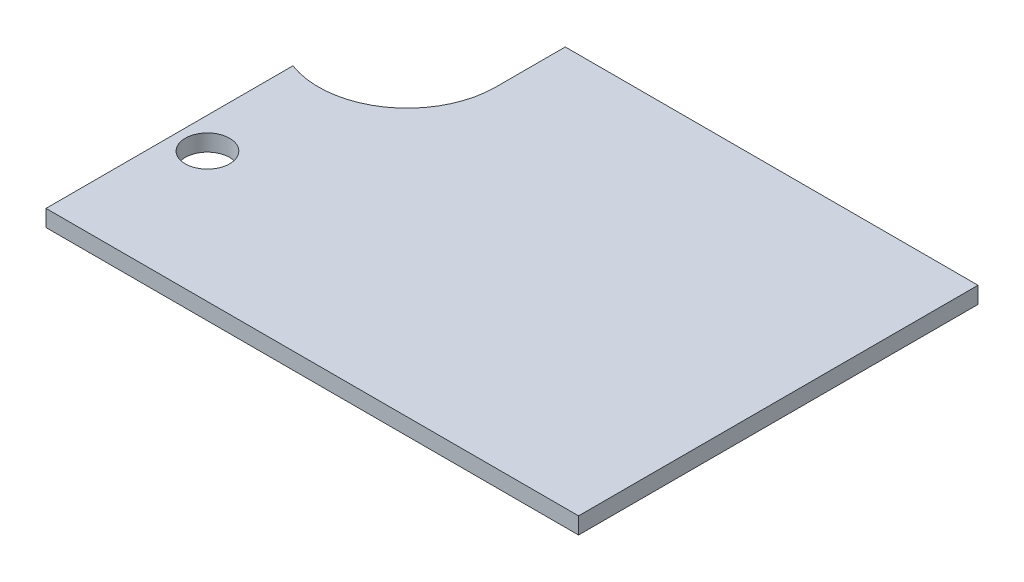
ISO-10303-21;
HEADER;
FILE_DESCRIPTION(('STEP AP214'),'2;1');
FILE_NAME('part.step','',(''),(''),'','','');
FILE_SCHEMA(('AUTOMOTIVE_DESIGN { 1 0 10303 214 1 1 1 1 }'));
ENDSEC;
DATA;
#1=APPLICATION_CONTEXT('core data for automotive mechanical design processes');
#2=APPLICATION_PROTOCOL_DEFINITION('international standard','automotive_design',2000,#1);
#3=PRODUCT_CONTEXT('',#1,'mechanical');
#4=PRODUCT('Part','Part','',(#3));
#5=PRODUCT_RELATED_PRODUCT_CATEGORY('part','',(#4));
#6=PRODUCT_DEFINITION_FORMATION('','',#4);
#7=PRODUCT_DEFINITION_CONTEXT('part definition',#1,'design');
#8=PRODUCT_DEFINITION('design','',#6,#7);
#9=PRODUCT_DEFINITION_SHAPE('','',#8);
#10=(LENGTH_UNIT() NAMED_UNIT(*) SI_UNIT(.MILLI.,.METRE.));
#11=(NAMED_UNIT(*) PLANE_ANGLE_UNIT() SI_UNIT($,.RADIAN.));
#12=(NAMED_UNIT(*) SI_UNIT($,.STERADIAN.) SOLID_ANGLE_UNIT());
#13=UNCERTAINTY_MEASURE_WITH_UNIT(LENGTH_MEASURE(1.E-05),#10,'distance_accuracy_value','');
#14=(GEOMETRIC_REPRESENTATION_CONTEXT(3) GLOBAL_UNCERTAINTY_ASSIGNED_CONTEXT((#13)) GLOBAL_UNIT_ASSIGNED_CONTEXT((#10,
#11,#12)) REPRESENTATION_CONTEXT('',''));
#15=CARTESIAN_POINT('',(0.,0.,0.));
#16=DIRECTION('',(0.,0.,1.));
#17=DIRECTION('',(1.,0.,0.));
#18=AXIS2_PLACEMENT_3D('',#15,#16,#17);
#19=CARTESIAN_POINT('',(-304.8,19.05,-228.6));
#20=DIRECTION('',(1.,0.,0.));
#21=DIRECTION('',(0.,0.,-1.));
#22=AXIS2_PLACEMENT_3D('',#19,#20,#21);
#23=PLANE('',#22);
#24=DIRECTION('',(0.,0.,1.));
#25=VECTOR('',#24,1.);
#26=CARTESIAN_POINT('',(-304.8,19.05,-228.6));
#27=LINE('',#26,#25);
#28=CARTESIAN_POINT('',(-304.8,19.05,-54.0512305043983));
#29=VERTEX_POINT('',#28);
#30=CARTESIAN_POINT('',(-304.8,19.05,228.6));
#31=VERTEX_POINT('',#30);
#32=EDGE_CURVE('E78',#29,#31,#27,.T.);
#33=ORIENTED_EDGE('',*,*,#32,.F.);
#34=DIRECTION('',(0.,-1.,0.));
#35=VECTOR('',#34,1.);
#36=CARTESIAN_POINT('',(-304.8,19.05,-54.0512305043983));
#37=LINE('',#36,#35);
#38=CARTESIAN_POINT('',(-304.8,0.,-54.0512305043983));
#39=VERTEX_POINT('',#38);
#40=EDGE_CURVE('E129',#29,#39,#37,.T.);
#41=ORIENTED_EDGE('',*,*,#40,.T.);
#42=DIRECTION('',(0.,0.,1.));
#43=VECTOR('',#42,1.);
#44=CARTESIAN_POINT('',(-304.8,0.,-228.6));
#45=LINE('',#44,#43);
#46=CARTESIAN_POINT('',(-304.8,0.,228.6));
#47=VERTEX_POINT('',#46);
#48=EDGE_CURVE('E123',#39,#47,#45,.T.);
#49=ORIENTED_EDGE('',*,*,#48,.T.);
#50=DIRECTION('',(0.,-1.,0.));
#51=VECTOR('',#50,1.);
#52=CARTESIAN_POINT('',(-304.8,19.05,228.6));
#53=LINE('',#52,#51);
#54=EDGE_CURVE('E11',#31,#47,#53,.T.);
#55=ORIENTED_EDGE('',*,*,#54,.F.);
#56=EDGE_LOOP('',(#33,#41,#49,#55));
#57=FACE_BOUND('',#56,.T.);
#58=ADVANCED_FACE('F33',(#57),#23,.F.);
#59=CARTESIAN_POINT('',(-304.8,19.05,228.6));
#60=DIRECTION('',(0.,0.,-1.));
#61=DIRECTION('',(-1.,0.,0.));
#62=AXIS2_PLACEMENT_3D('',#59,#60,#61);
#63=PLANE('',#62);
#64=DIRECTION('',(1.,0.,0.));
#65=VECTOR('',#64,1.);
#66=CARTESIAN_POINT('',(-304.8,0.,228.6));
#67=LINE('',#66,#65);
#68=CARTESIAN_POINT('',(304.8,0.,228.6));
#69=VERTEX_POINT('',#68);
#70=EDGE_CURVE('E114',#47,#69,#67,.T.);
#71=ORIENTED_EDGE('',*,*,#70,.T.);
#72=DIRECTION('',(0.,-1.,0.));
#73=VECTOR('',#72,1.);
#74=CARTESIAN_POINT('',(304.8,19.05,228.6));
#75=LINE('',#74,#73);
#76=CARTESIAN_POINT('',(304.8,19.05,228.6));
#77=VERTEX_POINT('',#76);
#78=EDGE_CURVE('E40',#77,#69,#75,.T.);
#79=ORIENTED_EDGE('',*,*,#78,.F.);
#80=DIRECTION('',(1.,0.,0.));
#81=VECTOR('',#80,1.);
#82=CARTESIAN_POINT('',(-304.8,19.05,228.6));
#83=LINE('',#82,#81);
#84=EDGE_CURVE('E112',#31,#77,#83,.T.);
#85=ORIENTED_EDGE('',*,*,#84,.F.);
#86=ORIENTED_EDGE('',*,*,#54,.T.);
#87=EDGE_LOOP('',(#71,#79,#85,#86));
#88=FACE_BOUND('',#87,.T.);
#89=ADVANCED_FACE('F125',(#88),#63,.F.);
#90=CARTESIAN_POINT('',(304.8,19.05,-228.6));
#91=DIRECTION('',(-1.,0.,0.));
#92=DIRECTION('',(0.,0.,1.));
#93=AXIS2_PLACEMENT_3D('',#90,#91,#92);
#94=PLANE('',#93);
#95=DIRECTION('',(0.,0.,-1.));
#96=VECTOR('',#95,1.);
#97=CARTESIAN_POINT('',(304.8,0.,-228.6));
#98=LINE('',#97,#96);
#99=CARTESIAN_POINT('',(304.8,0.,-228.6));
#100=VERTEX_POINT('',#99);
#101=EDGE_CURVE('E73',#69,#100,#98,.T.);
#102=ORIENTED_EDGE('',*,*,#101,.T.);
#103=DIRECTION('',(0.,-1.,0.));
#104=VECTOR('',#103,1.);
#105=CARTESIAN_POINT('',(304.8,19.05,-228.6));
#106=LINE('',#105,#104);
#107=CARTESIAN_POINT('',(304.8,19.05,-228.6));
#108=VERTEX_POINT('',#107);
#109=EDGE_CURVE('E110',#108,#100,#106,.T.);
#110=ORIENTED_EDGE('',*,*,#109,.F.);
#111=DIRECTION('',(0.,0.,-1.));
#112=VECTOR('',#111,1.);
#113=CARTESIAN_POINT('',(304.8,19.05,-228.6));
#114=LINE('',#113,#112);
#115=EDGE_CURVE('E56',#77,#108,#114,.T.);
#116=ORIENTED_EDGE('',*,*,#115,.F.);
#117=ORIENTED_EDGE('',*,*,#78,.T.);
#118=EDGE_LOOP('',(#102,#110,#116,#117));
#119=FACE_BOUND('',#118,.T.);
#120=ADVANCED_FACE('F120',(#119),#94,.F.);
#121=CARTESIAN_POINT('',(-304.8,19.05,-228.6));
#122=DIRECTION('',(0.,0.,1.));
#123=DIRECTION('',(1.,0.,0.));
#124=AXIS2_PLACEMENT_3D('',#121,#122,#123);
#125=PLANE('',#124);
#126=DIRECTION('',(-1.,0.,0.));
#127=VECTOR('',#126,1.);
#128=CARTESIAN_POINT('',(-304.8,0.,-228.6));
#129=LINE('',#128,#127);
#130=CARTESIAN_POINT('',(-167.639999999999,0.,-228.6));
#131=VERTEX_POINT('',#130);
#132=EDGE_CURVE('E105',#100,#131,#129,.T.);
#133=ORIENTED_EDGE('',*,*,#132,.T.);
#134=DIRECTION('',(0.,1.,0.));
#135=VECTOR('',#134,1.);
#136=CARTESIAN_POINT('',(-167.639999999999,0.,-228.6));
#137=LINE('',#136,#135);
#138=CARTESIAN_POINT('',(-167.639999999999,19.05,-228.6));
#139=VERTEX_POINT('',#138);
#140=EDGE_CURVE('E92',#131,#139,#137,.T.);
#141=ORIENTED_EDGE('',*,*,#140,.T.);
#142=DIRECTION('',(-1.,0.,0.));
#143=VECTOR('',#142,1.);
#144=CARTESIAN_POINT('',(-304.8,19.05,-228.6));
#145=LINE('',#144,#143);
#146=EDGE_CURVE('E118',#108,#139,#145,.T.);
#147=ORIENTED_EDGE('',*,*,#146,.F.);
#148=ORIENTED_EDGE('',*,*,#109,.T.);
#149=EDGE_LOOP('',(#133,#141,#147,#148));
#150=FACE_BOUND('',#149,.T.);
#151=ADVANCED_FACE('F109',(#150),#125,.F.);
#152=CARTESIAN_POINT('',(-304.8,19.05,228.6));
#153=DIRECTION('',(0.,1.,0.));
#154=DIRECTION('',(0.,0.,1.));
#155=AXIS2_PLACEMENT_3D('',#152,#153,#154);
#156=PLANE('',#155);
#157=DIRECTION('',(0.,0.,-1.));
#158=VECTOR('',#157,1.);
#159=CARTESIAN_POINT('',(-167.639999999999,19.05,-149.22499999999));
#160=LINE('',#159,#158);
#161=CARTESIAN_POINT('',(-167.639999999999,19.05,-149.22499999999));
#162=VERTEX_POINT('',#161);
#163=EDGE_CURVE('E95',#162,#139,#160,.T.);
#164=ORIENTED_EDGE('',*,*,#163,.F.);
#165=CARTESIAN_POINT('',(-269.239999999999,19.05,-149.22499999999));
#166=DIRECTION('',(0.,-1.,0.));
#167=DIRECTION('',(0.,0.,-1.));
#168=AXIS2_PLACEMENT_3D('',#165,#166,#167);
#169=CIRCLE('',#168,101.6);
#170=EDGE_CURVE('E142',#162,#29,#169,.T.);
#171=ORIENTED_EDGE('',*,*,#170,.T.);
#172=ORIENTED_EDGE('',*,*,#32,.T.);
#173=ORIENTED_EDGE('',*,*,#84,.T.);
#174=ORIENTED_EDGE('',*,*,#115,.T.);
#175=ORIENTED_EDGE('',*,*,#146,.T.);
#176=EDGE_LOOP('',(#164,#171,#172,#173,#174,#175));
#177=FACE_BOUND('',#176,.T.);
#178=CARTESIAN_POINT('',(-269.239999999999,19.05,79.3750000000104));
#179=DIRECTION('',(0.,-1.,0.));
#180=DIRECTION('',(0.,0.,-1.));
#181=AXIS2_PLACEMENT_3D('',#178,#179,#180);
#182=CIRCLE('',#181,25.4);
#183=CARTESIAN_POINT('',(-269.239999999999,19.05,53.9750000000104));
#184=VERTEX_POINT('',#183);
#185=EDGE_CURVE('E130',#184,#184,#182,.T.);
#186=ORIENTED_EDGE('',*,*,#185,.T.);
#187=EDGE_LOOP('',(#186));
#188=FACE_BOUND('',#187,.T.);
#189=ADVANCED_FACE('F148',(#177,#188),#156,.T.);
#190=CARTESIAN_POINT('',(-304.8,0.,228.6));
#191=DIRECTION('',(0.,1.,0.));
#192=DIRECTION('',(0.,0.,1.));
#193=AXIS2_PLACEMENT_3D('',#190,#191,#192);
#194=PLANE('',#193);
#195=CARTESIAN_POINT('',(-269.239999999999,0.,79.3750000000104));
#196=DIRECTION('',(0.,-1.,0.));
#197=DIRECTION('',(0.,0.,-1.));
#198=AXIS2_PLACEMENT_3D('',#195,#196,#197);
#199=CIRCLE('',#198,25.4);
#200=CARTESIAN_POINT('',(-269.239999999999,0.,53.9750000000104));
#201=VERTEX_POINT('',#200);
#202=EDGE_CURVE('E133',#201,#201,#199,.T.);
#203=ORIENTED_EDGE('',*,*,#202,.F.);
#204=EDGE_LOOP('',(#203));
#205=FACE_BOUND('',#204,.T.);
#206=CARTESIAN_POINT('',(-269.239999999999,0.,-149.22499999999));
#207=DIRECTION('',(0.,-1.,0.));
#208=DIRECTION('',(0.,0.,-1.));
#209=AXIS2_PLACEMENT_3D('',#206,#207,#208);
#210=CIRCLE('',#209,101.6);
#211=CARTESIAN_POINT('',(-167.639999999999,0.,-149.22499999999));
#212=VERTEX_POINT('',#211);
#213=EDGE_CURVE('E107',#212,#39,#210,.T.);
#214=ORIENTED_EDGE('',*,*,#213,.F.);
#215=DIRECTION('',(0.,0.,-1.));
#216=VECTOR('',#215,1.);
#217=CARTESIAN_POINT('',(-167.639999999999,0.,-149.22499999999));
#218=LINE('',#217,#216);
#219=EDGE_CURVE('E47',#212,#131,#218,.T.);
#220=ORIENTED_EDGE('',*,*,#219,.T.);
#221=ORIENTED_EDGE('',*,*,#132,.F.);
#222=ORIENTED_EDGE('',*,*,#101,.F.);
#223=ORIENTED_EDGE('',*,*,#70,.F.);
#224=ORIENTED_EDGE('',*,*,#48,.F.);
#225=EDGE_LOOP('',(#214,#220,#221,#222,#223,#224));
#226=FACE_BOUND('',#225,.T.);
#227=ADVANCED_FACE('F104',(#205,#226),#194,.F.);
#228=CARTESIAN_POINT('',(-269.239999999999,19.05,79.3750000000104));
#229=DIRECTION('',(0.,-1.,0.));
#230=DIRECTION('',(0.,0.,-1.));
#231=AXIS2_PLACEMENT_3D('',#228,#229,#230);
#232=CYLINDRICAL_SURFACE('',#231,25.4);
#233=CARTESIAN_POINT('',(-269.239999999999,19.05,53.9750000000104));
#234=CARTESIAN_POINT('',(-269.239999999999,18.8515625,53.9750000000104));
#235=CARTESIAN_POINT('',(-269.239999999999,18.653125,53.9750000000104));
#236=CARTESIAN_POINT('',(-269.239999999999,18.25625,53.9750000000104));
#237=CARTESIAN_POINT('',(-269.239999999999,18.0578125,53.9750000000104));
#238=CARTESIAN_POINT('',(-269.239999999999,17.6609375,53.9750000000104));
#239=CARTESIAN_POINT('',(-269.239999999999,17.4625,53.9750000000104));
#240=CARTESIAN_POINT('',(-269.239999999999,17.065625,53.9750000000104));
#241=CARTESIAN_POINT('',(-269.239999999999,16.8671875,53.9750000000104));
#242=CARTESIAN_POINT('',(-269.239999999999,16.4703125,53.9750000000104));
#243=CARTESIAN_POINT('',(-269.239999999999,16.271875,53.9750000000104));
#244=CARTESIAN_POINT('',(-269.239999999999,15.875,53.9750000000104));
#245=CARTESIAN_POINT('',(-269.239999999999,15.6765625,53.9750000000104));
#246=CARTESIAN_POINT('',(-269.239999999999,15.2796875,53.9750000000104));
#247=CARTESIAN_POINT('',(-269.239999999999,15.08125,53.9750000000104));
#248=CARTESIAN_POINT('',(-269.239999999999,14.684375,53.9750000000104));
#249=CARTESIAN_POINT('',(-269.239999999999,14.4859375,53.9750000000104));
#250=CARTESIAN_POINT('',(-269.239999999999,14.0890625,53.9750000000104));
#251=CARTESIAN_POINT('',(-269.239999999999,13.890625,53.9750000000104));
#252=CARTESIAN_POINT('',(-269.239999999999,13.49375,53.9750000000104));
#253=CARTESIAN_POINT('',(-269.239999999999,13.2953125,53.9750000000104));
#254=CARTESIAN_POINT('',(-269.239999999999,12.8984375,53.9750000000104));
#255=CARTESIAN_POINT('',(-269.239999999999,12.7,53.9750000000104));
#256=CARTESIAN_POINT('',(-269.239999999999,12.303125,53.9750000000104));
#257=CARTESIAN_POINT('',(-269.239999999999,12.1046875,53.9750000000104));
#258=CARTESIAN_POINT('',(-269.239999999999,11.7078125,53.9750000000104));
#259=CARTESIAN_POINT('',(-269.239999999999,11.509375,53.9750000000104));
#260=CARTESIAN_POINT('',(-269.239999999999,11.1125,53.9750000000104));
#261=CARTESIAN_POINT('',(-269.239999999999,10.9140625,53.9750000000104));
#262=CARTESIAN_POINT('',(-269.239999999999,10.5171875,53.9750000000104));
#263=CARTESIAN_POINT('',(-269.239999999999,10.31875,53.9750000000104));
#264=CARTESIAN_POINT('',(-269.239999999999,9.921875,53.9750000000104));
#265=CARTESIAN_POINT('',(-269.239999999999,9.7234375,53.9750000000104));
#266=CARTESIAN_POINT('',(-269.239999999999,9.3265625,53.9750000000104));
#267=CARTESIAN_POINT('',(-269.239999999999,9.128125,53.9750000000104));
#268=CARTESIAN_POINT('',(-269.239999999999,8.73125,53.9750000000104));
#269=CARTESIAN_POINT('',(-269.239999999999,8.5328125,53.9750000000104));
#270=CARTESIAN_POINT('',(-269.239999999999,8.1359375,53.9750000000104));
#271=CARTESIAN_POINT('',(-269.239999999999,7.9375,53.9750000000104));
#272=CARTESIAN_POINT('',(-269.239999999999,7.540625,53.9750000000104));
#273=CARTESIAN_POINT('',(-269.239999999999,7.3421875,53.9750000000104));
#274=CARTESIAN_POINT('',(-269.239999999999,6.9453125,53.9750000000104));
#275=CARTESIAN_POINT('',(-269.239999999999,6.746875,53.9750000000104));
#276=CARTESIAN_POINT('',(-269.239999999999,6.35,53.9750000000104));
#277=CARTESIAN_POINT('',(-269.239999999999,6.1515625,53.9750000000104));
#278=CARTESIAN_POINT('',(-269.239999999999,5.7546875,53.9750000000104));
#279=CARTESIAN_POINT('',(-269.239999999999,5.55625,53.9750000000104));
#280=CARTESIAN_POINT('',(-269.239999999999,5.159375,53.9750000000104));
#281=CARTESIAN_POINT('',(-269.239999999999,4.9609375,53.9750000000104));
#282=CARTESIAN_POINT('',(-269.239999999999,4.5640625,53.9750000000104));
#283=CARTESIAN_POINT('',(-269.239999999999,4.365625,53.9750000000104));
#284=CARTESIAN_POINT('',(-269.239999999999,3.96875,53.9750000000104));
#285=CARTESIAN_POINT('',(-269.239999999999,3.7703125,53.9750000000104));
#286=CARTESIAN_POINT('',(-269.239999999999,3.3734375,53.9750000000104));
#287=CARTESIAN_POINT('',(-269.239999999999,3.175,53.9750000000104));
#288=CARTESIAN_POINT('',(-269.239999999999,2.778125,53.9750000000104));
#289=CARTESIAN_POINT('',(-269.239999999999,2.5796875,53.9750000000104));
#290=CARTESIAN_POINT('',(-269.239999999999,2.1828125,53.9750000000104));
#291=CARTESIAN_POINT('',(-269.239999999999,1.984375,53.9750000000104));
#292=CARTESIAN_POINT('',(-269.239999999999,1.5875,53.9750000000104));
#293=CARTESIAN_POINT('',(-269.239999999999,1.3890625,53.9750000000104));
#294=CARTESIAN_POINT('',(-269.239999999999,0.992187500000001,53.9750000000104));
#295=CARTESIAN_POINT('',(-269.239999999999,0.793750000000001,53.9750000000104));
#296=CARTESIAN_POINT('',(-269.239999999999,0.396875,53.9750000000104));
#297=CARTESIAN_POINT('',(-269.239999999999,0.1984375,53.9750000000104));
#298=CARTESIAN_POINT('',(-269.239999999999,0.,53.9750000000104));
#299=B_SPLINE_CURVE_WITH_KNOTS('',3,(#233,#234,#235,#236,#237,#238,#239,#240,#241,#242,#243,
#244,#245,#246,#247,#248,#249,#250,#251,#252,#253,#254,#255,#256,#257,#258,#259,#260,#261,#262,
#263,#264,#265,#266,#267,#268,#269,#270,#271,#272,#273,#274,#275,#276,#277,#278,#279,#280,#281,
#282,#283,#284,#285,#286,#287,#288,#289,#290,#291,#292,#293,#294,#295,#296,#297,#298),
.UNSPECIFIED.,.F.,.F.,(4,2,2,2,2,2,2,2,2,2,2,2,2,2,2,2,2,2,2,2,2,2,2,2,2,2,2,2,2,2,2,2,4),(0.,
0.595312499999997,1.190625,1.7859375,2.38125,2.9765625,3.571875,4.1671875,4.7625,5.3578125,
5.953125,6.5484375,7.14375,7.7390625,8.334375,8.9296875,9.525,10.1203125,10.715625,11.3109375,
11.90625,12.5015625,13.096875,13.6921875,14.2875,14.8828125,15.478125,16.0734375,16.66875,
17.2640625,17.859375,18.4546875,19.05),.UNSPECIFIED.);
#300=EDGE_CURVE('BSEAM152',#184,#201,#299,.T.);
#301=ORIENTED_EDGE('',*,*,#185,.F.);
#302=ORIENTED_EDGE('',*,*,#202,.T.);
#303=ORIENTED_EDGE('',*,*,#300,.T.);
#304=ORIENTED_EDGE('',*,*,#300,.F.);
#305=EDGE_LOOP('',(#301,#303,#302,#304));
#306=FACE_BOUND('',#305,.T.);
#307=ADVANCED_FACE('F152',(#306),#232,.F.);
#308=CARTESIAN_POINT('',(-269.239999999999,19.05,-149.22499999999));
#309=DIRECTION('',(0.,-1.,0.));
#310=DIRECTION('',(0.,0.,-1.));
#311=AXIS2_PLACEMENT_3D('',#308,#309,#310);
#312=CYLINDRICAL_SURFACE('',#311,101.6);
#313=ORIENTED_EDGE('',*,*,#170,.F.);
#314=DIRECTION('',(0.,1.,0.));
#315=VECTOR('',#314,1.);
#316=CARTESIAN_POINT('',(-167.639999999999,0.,-149.22499999999));
#317=LINE('',#316,#315);
#318=EDGE_CURVE('E99',#212,#162,#317,.T.);
#319=ORIENTED_EDGE('',*,*,#318,.F.);
#320=ORIENTED_EDGE('',*,*,#213,.T.);
#321=ORIENTED_EDGE('',*,*,#40,.F.);
#322=EDGE_LOOP('',(#313,#319,#320,#321));
#323=FACE_BOUND('',#322,.T.);
#324=ADVANCED_FACE('F150',(#323),#312,.F.);
#325=CARTESIAN_POINT('',(-167.639999999999,0.,-149.22499999999));
#326=DIRECTION('',(1.,0.,0.));
#327=DIRECTION('',(0.,0.,-1.));
#328=AXIS2_PLACEMENT_3D('',#325,#326,#327);
#329=PLANE('',#328);
#330=ORIENTED_EDGE('',*,*,#163,.T.);
#331=ORIENTED_EDGE('',*,*,#140,.F.);
#332=ORIENTED_EDGE('',*,*,#219,.F.);
#333=ORIENTED_EDGE('',*,*,#318,.T.);
#334=EDGE_LOOP('',(#330,#331,#332,#333));
#335=FACE_BOUND('',#334,.T.);
#336=ADVANCED_FACE('F93',(#335),#329,.F.);
#337=CLOSED_SHELL('',(#58,#89,#120,#151,#189,#227,#307,#324,#336));
#338=MANIFOLD_SOLID_BREP('B2',#337);
#339=ADVANCED_BREP_SHAPE_REPRESENTATION('',(#18,#338),#14);
#340=SHAPE_DEFINITION_REPRESENTATION(#9,#339);
ENDSEC;
END-ISO-10303-21;
